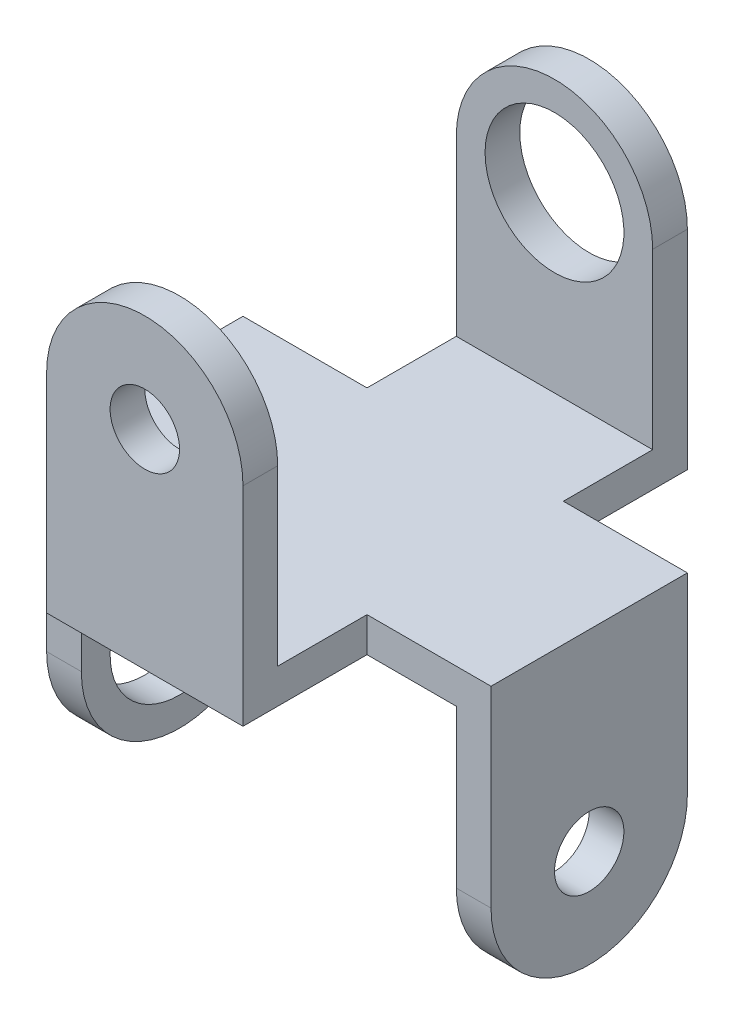
ISO-10303-21;
HEADER;
FILE_DESCRIPTION(('STEP AP214'),'2;1');
FILE_NAME('part.step','',(''),(''),'','','');
FILE_SCHEMA(('AUTOMOTIVE_DESIGN { 1 0 10303 214 1 1 1 1 }'));
ENDSEC;
DATA;
#1=APPLICATION_CONTEXT('core data for automotive mechanical design processes');
#2=APPLICATION_PROTOCOL_DEFINITION('international standard','automotive_design',2000,#1);
#3=PRODUCT_CONTEXT('',#1,'mechanical');
#4=PRODUCT('Part','Part','',(#3));
#5=PRODUCT_RELATED_PRODUCT_CATEGORY('part','',(#4));
#6=PRODUCT_DEFINITION_FORMATION('','',#4);
#7=PRODUCT_DEFINITION_CONTEXT('part definition',#1,'design');
#8=PRODUCT_DEFINITION('design','',#6,#7);
#9=PRODUCT_DEFINITION_SHAPE('','',#8);
#10=(LENGTH_UNIT() NAMED_UNIT(*) SI_UNIT(.MILLI.,.METRE.));
#11=(NAMED_UNIT(*) PLANE_ANGLE_UNIT() SI_UNIT($,.RADIAN.));
#12=(NAMED_UNIT(*) SI_UNIT($,.STERADIAN.) SOLID_ANGLE_UNIT());
#13=UNCERTAINTY_MEASURE_WITH_UNIT(LENGTH_MEASURE(1.E-05),#10,'distance_accuracy_value','');
#14=(GEOMETRIC_REPRESENTATION_CONTEXT(3) GLOBAL_UNCERTAINTY_ASSIGNED_CONTEXT((#13)) GLOBAL_UNIT_ASSIGNED_CONTEXT((#10,
#11,#12)) REPRESENTATION_CONTEXT('',''));
#15=CARTESIAN_POINT('',(0.,0.,0.));
#16=DIRECTION('',(0.,0.,1.));
#17=DIRECTION('',(1.,0.,0.));
#18=AXIS2_PLACEMENT_3D('',#15,#16,#17);
#19=CARTESIAN_POINT('',(0.,-0.867297677561354,0.));
#20=DIRECTION('',(0.,-1.,0.));
#21=DIRECTION('',(1.,0.,0.));
#22=AXIS2_PLACEMENT_3D('',#19,#20,#21);
#23=PLANE('',#22);
#24=DIRECTION('',(1.,0.,0.));
#25=VECTOR('',#24,1.);
#26=CARTESIAN_POINT('',(0.,-0.867297677561354,17.86285));
#27=LINE('',#26,#25);
#28=CARTESIAN_POINT('',(42.1458232874486,-0.867297677561364,17.86285));
#29=VERTEX_POINT('',#28);
#30=CARTESIAN_POINT('',(55.0086876637176,-0.867297677561354,17.86285));
#31=VERTEX_POINT('',#30);
#32=EDGE_CURVE('E187',#29,#31,#27,.T.);
#33=ORIENTED_EDGE('',*,*,#32,.T.);
#34=DIRECTION('',(0.,0.,1.));
#35=VECTOR('',#34,1.);
#36=CARTESIAN_POINT('',(55.0086876637176,-0.867297677561354,17.86285));
#37=LINE('',#36,#35);
#38=CARTESIAN_POINT('',(55.0086876637176,-0.867297677561354,46.14715));
#39=VERTEX_POINT('',#38);
#40=EDGE_CURVE('E175',#31,#39,#37,.T.);
#41=ORIENTED_EDGE('',*,*,#40,.T.);
#42=DIRECTION('',(1.,0.,0.));
#43=VECTOR('',#42,1.);
#44=CARTESIAN_POINT('',(0.,-0.867297677561354,46.14715));
#45=LINE('',#44,#43);
#46=CARTESIAN_POINT('',(42.1458232874486,-0.867297677561364,46.14715));
#47=VERTEX_POINT('',#46);
#48=EDGE_CURVE('E61',#47,#39,#45,.T.);
#49=ORIENTED_EDGE('',*,*,#48,.F.);
#50=DIRECTION('',(0.,0.,1.));
#51=VECTOR('',#50,1.);
#52=CARTESIAN_POINT('',(42.1458232874486,-0.867297677561364,5.));
#53=LINE('',#52,#51);
#54=CARTESIAN_POINT('',(42.1458232874486,-0.867297677561357,64.01));
#55=VERTEX_POINT('',#54);
#56=EDGE_CURVE('E263',#47,#55,#53,.T.);
#57=ORIENTED_EDGE('',*,*,#56,.T.);
#58=DIRECTION('',(1.,0.,0.));
#59=VECTOR('',#58,1.);
#60=CARTESIAN_POINT('',(13.8615520399867,-0.867297677561357,64.01));
#61=LINE('',#60,#59);
#62=CARTESIAN_POINT('',(13.8615520399867,-0.867297677561357,64.01));
#63=VERTEX_POINT('',#62);
#64=EDGE_CURVE('E223',#63,#55,#61,.T.);
#65=ORIENTED_EDGE('',*,*,#64,.F.);
#66=DIRECTION('',(0.,0.,-1.));
#67=VECTOR('',#66,1.);
#68=CARTESIAN_POINT('',(13.8615520399867,-0.867297677561357,5.));
#69=LINE('',#68,#67);
#70=CARTESIAN_POINT('',(13.8615520399867,-0.867297677561357,46.14715));
#71=VERTEX_POINT('',#70);
#72=EDGE_CURVE('E258',#63,#71,#69,.T.);
#73=ORIENTED_EDGE('',*,*,#72,.T.);
#74=CARTESIAN_POINT('',(0.998687663717631,-0.867297677561354,46.14715));
#75=VERTEX_POINT('',#74);
#76=EDGE_CURVE('E207',#75,#71,#45,.T.);
#77=ORIENTED_EDGE('',*,*,#76,.F.);
#78=DIRECTION('',(0.,0.,1.));
#79=VECTOR('',#78,1.);
#80=CARTESIAN_POINT('',(0.998687663717631,-0.867297677561354,46.14715));
#81=LINE('',#80,#79);
#82=CARTESIAN_POINT('',(0.998687663717633,-0.867297677561354,17.86285));
#83=VERTEX_POINT('',#82);
#84=EDGE_CURVE('E54',#83,#75,#81,.T.);
#85=ORIENTED_EDGE('',*,*,#84,.F.);
#86=CARTESIAN_POINT('',(13.8615520399867,-0.867297677561357,17.86285));
#87=VERTEX_POINT('',#86);
#88=EDGE_CURVE('E197',#83,#87,#27,.T.);
#89=ORIENTED_EDGE('',*,*,#88,.T.);
#90=CARTESIAN_POINT('',(13.8615520399867,-0.867297677561357,0.));
#91=VERTEX_POINT('',#90);
#92=EDGE_CURVE('E257',#87,#91,#69,.T.);
#93=ORIENTED_EDGE('',*,*,#92,.T.);
#94=DIRECTION('',(1.,0.,0.));
#95=VECTOR('',#94,1.);
#96=CARTESIAN_POINT('',(13.8615520399867,-0.867297677561357,0.));
#97=LINE('',#96,#95);
#98=CARTESIAN_POINT('',(42.1458232874486,-0.867297677561364,0.));
#99=VERTEX_POINT('',#98);
#100=EDGE_CURVE('E261',#91,#99,#97,.T.);
#101=ORIENTED_EDGE('',*,*,#100,.T.);
#102=EDGE_CURVE('E196',#99,#29,#53,.T.);
#103=ORIENTED_EDGE('',*,*,#102,.T.);
#104=EDGE_LOOP('',(#33,#41,#49,#57,#65,#73,#77,#85,#89,#93,#101,#103));
#105=FACE_BOUND('',#104,.T.);
#106=ADVANCED_FACE('F38',(#105),#23,.T.);
#107=CARTESIAN_POINT('',(13.8615520399867,4.13270232243864,5.));
#108=DIRECTION('',(1.,0.,0.));
#109=DIRECTION('',(0.,0.,-1.));
#110=AXIS2_PLACEMENT_3D('',#107,#108,#109);
#111=PLANE('',#110);
#112=DIRECTION('',(0.,1.,0.));
#113=VECTOR('',#112,1.);
#114=CARTESIAN_POINT('',(13.8615520399867,4.13270232243864,46.14715));
#115=LINE('',#114,#113);
#116=CARTESIAN_POINT('',(13.8615520399867,4.13270232243864,46.14715));
#117=VERTEX_POINT('',#116);
#118=EDGE_CURVE('E212',#71,#117,#115,.T.);
#119=ORIENTED_EDGE('',*,*,#118,.F.);
#120=ORIENTED_EDGE('',*,*,#72,.F.);
#121=DIRECTION('',(0.,-1.,0.));
#122=VECTOR('',#121,1.);
#123=CARTESIAN_POINT('',(13.8615520399867,4.13270232243864,64.01));
#124=LINE('',#123,#122);
#125=CARTESIAN_POINT('',(13.8615520399867,29.1327023224386,64.01));
#126=VERTEX_POINT('',#125);
#127=EDGE_CURVE('E220',#126,#63,#124,.T.);
#128=ORIENTED_EDGE('',*,*,#127,.F.);
#129=DIRECTION('',(0.,0.,-1.));
#130=VECTOR('',#129,1.);
#131=CARTESIAN_POINT('',(13.8615520399867,29.1327023224386,64.01));
#132=LINE('',#131,#130);
#133=CARTESIAN_POINT('',(13.8615520399867,29.1327023224386,59.01));
#134=VERTEX_POINT('',#133);
#135=EDGE_CURVE('E232',#126,#134,#132,.T.);
#136=ORIENTED_EDGE('',*,*,#135,.T.);
#137=DIRECTION('',(0.,-1.,0.));
#138=VECTOR('',#137,1.);
#139=CARTESIAN_POINT('',(13.8615520399867,29.1327023224386,59.01));
#140=LINE('',#139,#138);
#141=CARTESIAN_POINT('',(13.8615520399867,4.13270232243865,59.01));
#142=VERTEX_POINT('',#141);
#143=EDGE_CURVE('E224',#134,#142,#140,.T.);
#144=ORIENTED_EDGE('',*,*,#143,.T.);
#145=DIRECTION('',(0.,0.,-1.));
#146=VECTOR('',#145,1.);
#147=CARTESIAN_POINT('',(13.8615520399867,4.13270232243864,59.01));
#148=LINE('',#147,#146);
#149=EDGE_CURVE('E250',#142,#117,#148,.T.);
#150=ORIENTED_EDGE('',*,*,#149,.T.);
#151=EDGE_LOOP('',(#119,#120,#128,#136,#144,#150));
#152=FACE_BOUND('',#151,.T.);
#153=ADVANCED_FACE('F406',(#152),#111,.F.);
#154=CARTESIAN_POINT('',(42.1458232874486,29.1327023224386,5.));
#155=DIRECTION('',(-1.,0.,0.));
#156=DIRECTION('',(0.,-1.,0.));
#157=AXIS2_PLACEMENT_3D('',#154,#155,#156);
#158=PLANE('',#157);
#159=DIRECTION('',(0.,-1.,0.));
#160=VECTOR('',#159,1.);
#161=CARTESIAN_POINT('',(42.1458232874486,29.1327023224386,46.14715));
#162=LINE('',#161,#160);
#163=CARTESIAN_POINT('',(42.1458232874486,4.13270232243864,46.14715));
#164=VERTEX_POINT('',#163);
#165=EDGE_CURVE('E210',#164,#47,#162,.T.);
#166=ORIENTED_EDGE('',*,*,#165,.F.);
#167=DIRECTION('',(0.,0.,-1.));
#168=VECTOR('',#167,1.);
#169=CARTESIAN_POINT('',(42.1458232874486,4.13270232243864,59.01));
#170=LINE('',#169,#168);
#171=CARTESIAN_POINT('',(42.1458232874486,4.13270232243864,59.01));
#172=VERTEX_POINT('',#171);
#173=EDGE_CURVE('E254',#172,#164,#170,.T.);
#174=ORIENTED_EDGE('',*,*,#173,.F.);
#175=DIRECTION('',(0.,1.,0.));
#176=VECTOR('',#175,1.);
#177=CARTESIAN_POINT('',(42.1458232874486,4.13270232243864,59.01));
#178=LINE('',#177,#176);
#179=CARTESIAN_POINT('',(42.1458232874486,29.1327023224386,59.01));
#180=VERTEX_POINT('',#179);
#181=EDGE_CURVE('E219',#172,#180,#178,.T.);
#182=ORIENTED_EDGE('',*,*,#181,.T.);
#183=DIRECTION('',(0.,0.,-1.));
#184=VECTOR('',#183,1.);
#185=CARTESIAN_POINT('',(42.1458232874486,29.1327023224386,64.01));
#186=LINE('',#185,#184);
#187=CARTESIAN_POINT('',(42.1458232874486,29.1327023224386,64.01));
#188=VERTEX_POINT('',#187);
#189=EDGE_CURVE('E240',#188,#180,#186,.T.);
#190=ORIENTED_EDGE('',*,*,#189,.F.);
#191=DIRECTION('',(0.,1.,0.));
#192=VECTOR('',#191,1.);
#193=CARTESIAN_POINT('',(42.1458232874486,-0.867297677561357,64.01));
#194=LINE('',#193,#192);
#195=EDGE_CURVE('E227',#55,#188,#194,.T.);
#196=ORIENTED_EDGE('',*,*,#195,.F.);
#197=ORIENTED_EDGE('',*,*,#56,.F.);
#198=EDGE_LOOP('',(#166,#174,#182,#190,#196,#197));
#199=FACE_BOUND('',#198,.T.);
#200=ADVANCED_FACE('F411',(#199),#158,.F.);
#201=CARTESIAN_POINT('',(28.0036876637176,29.1327023224386,5.));
#202=DIRECTION('',(0.,0.,-1.));
#203=DIRECTION('',(-1.,0.,0.));
#204=AXIS2_PLACEMENT_3D('',#201,#202,#203);
#205=CYLINDRICAL_SURFACE('',#204,14.1421356237309);
#206=CARTESIAN_POINT('',(28.0036876637176,29.1327023224386,0.));
#207=DIRECTION('',(0.,0.,1.));
#208=DIRECTION('',(1.,0.,0.));
#209=AXIS2_PLACEMENT_3D('',#206,#207,#208);
#210=CIRCLE('',#209,14.1421356237309);
#211=CARTESIAN_POINT('',(42.1458232874486,29.1327023224386,0.));
#212=VERTEX_POINT('',#211);
#213=CARTESIAN_POINT('',(13.8615520399867,29.1327023224386,0.));
#214=VERTEX_POINT('',#213);
#215=EDGE_CURVE('E265',#212,#214,#210,.T.);
#216=ORIENTED_EDGE('',*,*,#215,.T.);
#217=DIRECTION('',(0.,0.,-1.));
#218=VECTOR('',#217,1.);
#219=CARTESIAN_POINT('',(13.8615520399867,29.1327023224386,5.));
#220=LINE('',#219,#218);
#221=CARTESIAN_POINT('',(13.8615520399867,29.1327023224386,5.));
#222=VERTEX_POINT('',#221);
#223=EDGE_CURVE('E11',#222,#214,#220,.T.);
#224=ORIENTED_EDGE('',*,*,#223,.F.);
#225=CARTESIAN_POINT('',(28.0036876637176,29.1327023224386,5.));
#226=DIRECTION('',(0.,0.,1.));
#227=DIRECTION('',(1.,0.,0.));
#228=AXIS2_PLACEMENT_3D('',#225,#226,#227);
#229=CIRCLE('',#228,14.1421356237309);
#230=CARTESIAN_POINT('',(42.1458232874486,29.1327023224386,5.));
#231=VERTEX_POINT('',#230);
#232=EDGE_CURVE('E266',#231,#222,#229,.T.);
#233=ORIENTED_EDGE('',*,*,#232,.F.);
#234=DIRECTION('',(0.,0.,-1.));
#235=VECTOR('',#234,1.);
#236=CARTESIAN_POINT('',(42.1458232874486,29.1327023224386,5.));
#237=LINE('',#236,#235);
#238=EDGE_CURVE('E47',#231,#212,#237,.T.);
#239=ORIENTED_EDGE('',*,*,#238,.T.);
#240=EDGE_LOOP('',(#216,#224,#233,#239));
#241=FACE_BOUND('',#240,.T.);
#242=ADVANCED_FACE('F40',(#241),#205,.T.);
#243=ORIENTED_EDGE('',*,*,#92,.F.);
#244=DIRECTION('',(0.,1.,0.));
#245=VECTOR('',#244,1.);
#246=CARTESIAN_POINT('',(13.8615520399867,4.13270232243864,17.86285));
#247=LINE('',#246,#245);
#248=CARTESIAN_POINT('',(13.8615520399867,4.13270232243864,17.86285));
#249=VERTEX_POINT('',#248);
#250=EDGE_CURVE('E216',#87,#249,#247,.T.);
#251=ORIENTED_EDGE('',*,*,#250,.T.);
#252=CARTESIAN_POINT('',(13.8615520399867,4.13270232243864,5.));
#253=VERTEX_POINT('',#252);
#254=EDGE_CURVE('E247',#249,#253,#148,.T.);
#255=ORIENTED_EDGE('',*,*,#254,.T.);
#256=DIRECTION('',(0.,-1.,0.));
#257=VECTOR('',#256,1.);
#258=CARTESIAN_POINT('',(13.8615520399867,4.13270232243864,5.));
#259=LINE('',#258,#257);
#260=EDGE_CURVE('E269',#222,#253,#259,.T.);
#261=ORIENTED_EDGE('',*,*,#260,.F.);
#262=ORIENTED_EDGE('',*,*,#223,.T.);
#263=DIRECTION('',(0.,-1.,0.));
#264=VECTOR('',#263,1.);
#265=CARTESIAN_POINT('',(13.8615520399867,4.13270232243864,0.));
#266=LINE('',#265,#264);
#267=EDGE_CURVE('E277',#214,#91,#266,.T.);
#268=ORIENTED_EDGE('',*,*,#267,.T.);
#269=EDGE_LOOP('',(#243,#251,#255,#261,#262,#268));
#270=FACE_BOUND('',#269,.T.);
#271=ADVANCED_FACE('F294',(#270),#111,.F.);
#272=CARTESIAN_POINT('',(42.1458232874486,4.13270232243864,17.86285));
#273=VERTEX_POINT('',#272);
#274=CARTESIAN_POINT('',(42.1458232874486,4.13270232243864,5.));
#275=VERTEX_POINT('',#274);
#276=EDGE_CURVE('E253',#273,#275,#170,.T.);
#277=ORIENTED_EDGE('',*,*,#276,.F.);
#278=DIRECTION('',(0.,-1.,0.));
#279=VECTOR('',#278,1.);
#280=CARTESIAN_POINT('',(42.1458232874486,29.1327023224386,17.86285));
#281=LINE('',#280,#279);
#282=EDGE_CURVE('E214',#273,#29,#281,.T.);
#283=ORIENTED_EDGE('',*,*,#282,.T.);
#284=ORIENTED_EDGE('',*,*,#102,.F.);
#285=DIRECTION('',(0.,1.,0.));
#286=VECTOR('',#285,1.);
#287=CARTESIAN_POINT('',(42.1458232874486,29.1327023224386,0.));
#288=LINE('',#287,#286);
#289=EDGE_CURVE('E270',#99,#212,#288,.T.);
#290=ORIENTED_EDGE('',*,*,#289,.T.);
#291=ORIENTED_EDGE('',*,*,#238,.F.);
#292=DIRECTION('',(0.,1.,0.));
#293=VECTOR('',#292,1.);
#294=CARTESIAN_POINT('',(42.1458232874486,29.1327023224386,5.));
#295=LINE('',#294,#293);
#296=EDGE_CURVE('E273',#275,#231,#295,.T.);
#297=ORIENTED_EDGE('',*,*,#296,.F.);
#298=EDGE_LOOP('',(#277,#283,#284,#290,#291,#297));
#299=FACE_BOUND('',#298,.T.);
#300=ADVANCED_FACE('F300',(#299),#158,.F.);
#301=CARTESIAN_POINT('',(28.0036876637176,29.1327023224386,5.));
#302=DIRECTION('',(0.,0.,1.));
#303=DIRECTION('',(1.,0.,0.));
#304=AXIS2_PLACEMENT_3D('',#301,#302,#303);
#305=PLANE('',#304);
#306=CARTESIAN_POINT('',(28.0036876637176,29.1327023224386,5.));
#307=DIRECTION('',(0.,0.,-1.));
#308=DIRECTION('',(-1.,0.,0.));
#309=AXIS2_PLACEMENT_3D('',#306,#307,#308);
#310=CIRCLE('',#309,10.);
#311=CARTESIAN_POINT('',(18.0036876637176,29.1327023224386,5.));
#312=VERTEX_POINT('',#311);
#313=EDGE_CURVE('E358',#312,#312,#310,.T.);
#314=ORIENTED_EDGE('',*,*,#313,.T.);
#315=EDGE_LOOP('',(#314));
#316=FACE_BOUND('',#315,.T.);
#317=DIRECTION('',(-1.,0.,0.));
#318=VECTOR('',#317,1.);
#319=CARTESIAN_POINT('',(13.8615520399867,4.13270232243864,5.));
#320=LINE('',#319,#318);
#321=EDGE_CURVE('E243',#275,#253,#320,.T.);
#322=ORIENTED_EDGE('',*,*,#321,.F.);
#323=ORIENTED_EDGE('',*,*,#296,.T.);
#324=ORIENTED_EDGE('',*,*,#232,.T.);
#325=ORIENTED_EDGE('',*,*,#260,.T.);
#326=EDGE_LOOP('',(#322,#323,#324,#325));
#327=FACE_BOUND('',#326,.T.);
#328=ADVANCED_FACE('F298',(#316,#327),#305,.T.);
#329=CARTESIAN_POINT('',(28.0036876637176,29.1327023224386,0.));
#330=DIRECTION('',(0.,0.,1.));
#331=DIRECTION('',(1.,0.,0.));
#332=AXIS2_PLACEMENT_3D('',#329,#330,#331);
#333=PLANE('',#332);
#334=CARTESIAN_POINT('',(28.0036876637176,29.1327023224386,0.));
#335=DIRECTION('',(0.,0.,-1.));
#336=DIRECTION('',(-1.,0.,0.));
#337=AXIS2_PLACEMENT_3D('',#334,#335,#336);
#338=CIRCLE('',#337,10.);
#339=CARTESIAN_POINT('',(18.0036876637176,29.1327023224386,0.));
#340=VERTEX_POINT('',#339);
#341=EDGE_CURVE('E359',#340,#340,#338,.T.);
#342=ORIENTED_EDGE('',*,*,#341,.F.);
#343=EDGE_LOOP('',(#342));
#344=FACE_BOUND('',#343,.T.);
#345=ORIENTED_EDGE('',*,*,#215,.F.);
#346=ORIENTED_EDGE('',*,*,#289,.F.);
#347=ORIENTED_EDGE('',*,*,#100,.F.);
#348=ORIENTED_EDGE('',*,*,#267,.F.);
#349=EDGE_LOOP('',(#345,#346,#347,#348));
#350=FACE_BOUND('',#349,.T.);
#351=ADVANCED_FACE('F290',(#344,#350),#333,.F.);
#352=CARTESIAN_POINT('',(13.8615520399867,4.13270232243864,59.01));
#353=DIRECTION('',(0.,-1.,0.));
#354=DIRECTION('',(0.,0.,-1.));
#355=AXIS2_PLACEMENT_3D('',#352,#353,#354);
#356=PLANE('',#355);
#357=ORIENTED_EDGE('',*,*,#254,.F.);
#358=DIRECTION('',(1.,0.,0.));
#359=VECTOR('',#358,1.);
#360=CARTESIAN_POINT('',(0.,4.13270232243865,17.86285));
#361=LINE('',#360,#359);
#362=CARTESIAN_POINT('',(-4.00131233628237,4.13270232243865,17.86285));
#363=VERTEX_POINT('',#362);
#364=EDGE_CURVE('E308',#363,#249,#361,.T.);
#365=ORIENTED_EDGE('',*,*,#364,.F.);
#366=DIRECTION('',(0.,0.,-1.));
#367=VECTOR('',#366,1.);
#368=CARTESIAN_POINT('',(-4.00131233628237,4.13270232243865,17.86285));
#369=LINE('',#368,#367);
#370=CARTESIAN_POINT('',(-4.00131233628237,4.13270232243865,46.14715));
#371=VERTEX_POINT('',#370);
#372=EDGE_CURVE('E198',#371,#363,#369,.T.);
#373=ORIENTED_EDGE('',*,*,#372,.F.);
#374=DIRECTION('',(1.,0.,0.));
#375=VECTOR('',#374,1.);
#376=CARTESIAN_POINT('',(0.,4.13270232243865,46.14715));
#377=LINE('',#376,#375);
#378=EDGE_CURVE('E205',#371,#117,#377,.T.);
#379=ORIENTED_EDGE('',*,*,#378,.T.);
#380=ORIENTED_EDGE('',*,*,#149,.F.);
#381=DIRECTION('',(-1.,0.,0.));
#382=VECTOR('',#381,1.);
#383=CARTESIAN_POINT('',(13.8615520399867,4.13270232243864,59.01));
#384=LINE('',#383,#382);
#385=EDGE_CURVE('E244',#172,#142,#384,.T.);
#386=ORIENTED_EDGE('',*,*,#385,.F.);
#387=ORIENTED_EDGE('',*,*,#173,.T.);
#388=CARTESIAN_POINT('',(60.0086876637176,4.13270232243863,46.14715));
#389=VERTEX_POINT('',#388);
#390=EDGE_CURVE('E309',#164,#389,#377,.T.);
#391=ORIENTED_EDGE('',*,*,#390,.T.);
#392=DIRECTION('',(0.,0.,1.));
#393=VECTOR('',#392,1.);
#394=CARTESIAN_POINT('',(60.0086876637176,4.13270232243863,17.86285));
#395=LINE('',#394,#393);
#396=CARTESIAN_POINT('',(60.0086876637176,4.13270232243863,17.86285));
#397=VERTEX_POINT('',#396);
#398=EDGE_CURVE('E306',#397,#389,#395,.T.);
#399=ORIENTED_EDGE('',*,*,#398,.F.);
#400=EDGE_CURVE('E209',#273,#397,#361,.T.);
#401=ORIENTED_EDGE('',*,*,#400,.F.);
#402=ORIENTED_EDGE('',*,*,#276,.T.);
#403=ORIENTED_EDGE('',*,*,#321,.T.);
#404=EDGE_LOOP('',(#357,#365,#373,#379,#380,#386,#387,#391,#399,#401,#402,#403));
#405=FACE_BOUND('',#404,.T.);
#406=ADVANCED_FACE('F303',(#405),#356,.F.);
#407=CARTESIAN_POINT('',(28.0036876637176,29.1327023224386,59.01));
#408=DIRECTION('',(0.,0.,1.));
#409=DIRECTION('',(1.,0.,0.));
#410=AXIS2_PLACEMENT_3D('',#407,#408,#409);
#411=PLANE('',#410);
#412=CARTESIAN_POINT('',(28.0036876637176,29.1327023224386,59.01));
#413=DIRECTION('',(0.,0.,1.));
#414=DIRECTION('',(1.,0.,0.));
#415=AXIS2_PLACEMENT_3D('',#412,#413,#414);
#416=CIRCLE('',#415,5.);
#417=CARTESIAN_POINT('',(33.0036876637176,29.1327023224386,59.01));
#418=VERTEX_POINT('',#417);
#419=EDGE_CURVE('E347',#418,#418,#416,.T.);
#420=ORIENTED_EDGE('',*,*,#419,.T.);
#421=EDGE_LOOP('',(#420));
#422=FACE_BOUND('',#421,.T.);
#423=ORIENTED_EDGE('',*,*,#181,.F.);
#424=ORIENTED_EDGE('',*,*,#385,.T.);
#425=ORIENTED_EDGE('',*,*,#143,.F.);
#426=CARTESIAN_POINT('',(28.0036876637176,29.1327023224386,59.01));
#427=DIRECTION('',(0.,0.,1.));
#428=DIRECTION('',(1.,0.,0.));
#429=AXIS2_PLACEMENT_3D('',#426,#427,#428);
#430=CIRCLE('',#429,14.1421356237309);
#431=EDGE_CURVE('E234',#180,#134,#430,.T.);
#432=ORIENTED_EDGE('',*,*,#431,.F.);
#433=EDGE_LOOP('',(#423,#424,#425,#432));
#434=FACE_BOUND('',#433,.T.);
#435=ADVANCED_FACE('F442',(#422,#434),#411,.F.);
#436=CARTESIAN_POINT('',(28.0036876637176,29.1327023224386,64.01));
#437=DIRECTION('',(0.,0.,-1.));
#438=DIRECTION('',(-1.,0.,0.));
#439=AXIS2_PLACEMENT_3D('',#436,#437,#438);
#440=CYLINDRICAL_SURFACE('',#439,14.1421356237309);
#441=ORIENTED_EDGE('',*,*,#431,.T.);
#442=ORIENTED_EDGE('',*,*,#135,.F.);
#443=CARTESIAN_POINT('',(28.0036876637176,29.1327023224386,64.01));
#444=DIRECTION('',(0.,0.,1.));
#445=DIRECTION('',(1.,0.,0.));
#446=AXIS2_PLACEMENT_3D('',#443,#444,#445);
#447=CIRCLE('',#446,14.1421356237309);
#448=EDGE_CURVE('E229',#188,#126,#447,.T.);
#449=ORIENTED_EDGE('',*,*,#448,.F.);
#450=ORIENTED_EDGE('',*,*,#189,.T.);
#451=EDGE_LOOP('',(#441,#442,#449,#450));
#452=FACE_BOUND('',#451,.T.);
#453=ADVANCED_FACE('F446',(#452),#440,.T.);
#454=CARTESIAN_POINT('',(28.0036876637176,29.1327023224386,64.01));
#455=DIRECTION('',(0.,0.,1.));
#456=DIRECTION('',(1.,0.,0.));
#457=AXIS2_PLACEMENT_3D('',#454,#455,#456);
#458=PLANE('',#457);
#459=CARTESIAN_POINT('',(28.0036876637176,29.1327023224386,64.01));
#460=DIRECTION('',(0.,0.,1.));
#461=DIRECTION('',(1.,0.,0.));
#462=AXIS2_PLACEMENT_3D('',#459,#460,#461);
#463=CIRCLE('',#462,5.);
#464=CARTESIAN_POINT('',(33.0036876637176,29.1327023224386,64.01));
#465=VERTEX_POINT('',#464);
#466=EDGE_CURVE('E350',#465,#465,#463,.T.);
#467=ORIENTED_EDGE('',*,*,#466,.F.);
#468=EDGE_LOOP('',(#467));
#469=FACE_BOUND('',#468,.T.);
#470=ORIENTED_EDGE('',*,*,#127,.T.);
#471=ORIENTED_EDGE('',*,*,#64,.T.);
#472=ORIENTED_EDGE('',*,*,#195,.T.);
#473=ORIENTED_EDGE('',*,*,#448,.T.);
#474=EDGE_LOOP('',(#470,#471,#472,#473));
#475=FACE_BOUND('',#474,.T.);
#476=ADVANCED_FACE('F449',(#469,#475),#458,.T.);
#477=CARTESIAN_POINT('',(0.,4.13270232243865,46.14715));
#478=DIRECTION('',(0.,0.,-1.));
#479=DIRECTION('',(-1.,0.,0.));
#480=AXIS2_PLACEMENT_3D('',#477,#478,#479);
#481=PLANE('',#480);
#482=ORIENTED_EDGE('',*,*,#390,.F.);
#483=ORIENTED_EDGE('',*,*,#165,.T.);
#484=ORIENTED_EDGE('',*,*,#48,.T.);
#485=DIRECTION('',(0.,-1.,0.));
#486=VECTOR('',#485,1.);
#487=CARTESIAN_POINT('',(55.0086876637176,-0.867297677561354,46.14715));
#488=LINE('',#487,#486);
#489=CARTESIAN_POINT('',(55.0086876637176,-23.5480976775614,46.14715));
#490=VERTEX_POINT('',#489);
#491=EDGE_CURVE('E182',#39,#490,#488,.T.);
#492=ORIENTED_EDGE('',*,*,#491,.T.);
#493=DIRECTION('',(1.,0.,0.));
#494=VECTOR('',#493,1.);
#495=CARTESIAN_POINT('',(55.0086876637176,-23.5480976775614,46.14715));
#496=LINE('',#495,#494);
#497=CARTESIAN_POINT('',(60.0086876637176,-23.5480976775614,46.14715));
#498=VERTEX_POINT('',#497);
#499=EDGE_CURVE('E340',#490,#498,#496,.T.);
#500=ORIENTED_EDGE('',*,*,#499,.T.);
#501=DIRECTION('',(0.,-1.,0.));
#502=VECTOR('',#501,1.);
#503=CARTESIAN_POINT('',(60.0086876637176,4.13270232243863,46.14715));
#504=LINE('',#503,#502);
#505=EDGE_CURVE('E338',#389,#498,#504,.T.);
#506=ORIENTED_EDGE('',*,*,#505,.F.);
#507=EDGE_LOOP('',(#482,#483,#484,#492,#500,#506));
#508=FACE_BOUND('',#507,.T.);
#509=ADVANCED_FACE('F453',(#508),#481,.F.);
#510=CARTESIAN_POINT('',(0.,4.13270232243865,17.86285));
#511=DIRECTION('',(0.,0.,-1.));
#512=DIRECTION('',(-1.,0.,0.));
#513=AXIS2_PLACEMENT_3D('',#510,#511,#512);
#514=PLANE('',#513);
#515=ORIENTED_EDGE('',*,*,#282,.F.);
#516=ORIENTED_EDGE('',*,*,#400,.T.);
#517=DIRECTION('',(0.,1.,0.));
#518=VECTOR('',#517,1.);
#519=CARTESIAN_POINT('',(60.0086876637176,-0.867297677561368,17.86285));
#520=LINE('',#519,#518);
#521=CARTESIAN_POINT('',(60.0086876637176,-23.5480976775614,17.86285));
#522=VERTEX_POINT('',#521);
#523=EDGE_CURVE('E336',#522,#397,#520,.T.);
#524=ORIENTED_EDGE('',*,*,#523,.F.);
#525=DIRECTION('',(1.,0.,0.));
#526=VECTOR('',#525,1.);
#527=CARTESIAN_POINT('',(55.0086876637176,-23.5480976775614,17.86285));
#528=LINE('',#527,#526);
#529=CARTESIAN_POINT('',(55.0086876637176,-23.5480976775614,17.86285));
#530=VERTEX_POINT('',#529);
#531=EDGE_CURVE('E190',#530,#522,#528,.T.);
#532=ORIENTED_EDGE('',*,*,#531,.F.);
#533=DIRECTION('',(0.,1.,0.));
#534=VECTOR('',#533,1.);
#535=CARTESIAN_POINT('',(55.0086876637176,-23.5480976775614,17.86285));
#536=LINE('',#535,#534);
#537=EDGE_CURVE('E179',#530,#31,#536,.T.);
#538=ORIENTED_EDGE('',*,*,#537,.T.);
#539=ORIENTED_EDGE('',*,*,#32,.F.);
#540=EDGE_LOOP('',(#515,#516,#524,#532,#538,#539));
#541=FACE_BOUND('',#540,.T.);
#542=ADVANCED_FACE('F186',(#541),#514,.T.);
#543=ORIENTED_EDGE('',*,*,#250,.F.);
#544=ORIENTED_EDGE('',*,*,#88,.F.);
#545=DIRECTION('',(0.,1.,0.));
#546=VECTOR('',#545,1.);
#547=CARTESIAN_POINT('',(0.998687663717629,-23.5480976775614,17.86285));
#548=LINE('',#547,#546);
#549=CARTESIAN_POINT('',(0.998687663717629,-23.5480976775614,17.86285));
#550=VERTEX_POINT('',#549);
#551=EDGE_CURVE('E316',#550,#83,#548,.T.);
#552=ORIENTED_EDGE('',*,*,#551,.F.);
#553=DIRECTION('',(1.,0.,0.));
#554=VECTOR('',#553,1.);
#555=CARTESIAN_POINT('',(-4.00131233628237,-23.5480976775614,17.86285));
#556=LINE('',#555,#554);
#557=CARTESIAN_POINT('',(-4.00131233628237,-23.5480976775614,17.86285));
#558=VERTEX_POINT('',#557);
#559=EDGE_CURVE('E324',#558,#550,#556,.T.);
#560=ORIENTED_EDGE('',*,*,#559,.F.);
#561=DIRECTION('',(0.,-1.,0.));
#562=VECTOR('',#561,1.);
#563=CARTESIAN_POINT('',(-4.00131233628237,4.13270232243865,17.86285));
#564=LINE('',#563,#562);
#565=EDGE_CURVE('E313',#363,#558,#564,.T.);
#566=ORIENTED_EDGE('',*,*,#565,.F.);
#567=ORIENTED_EDGE('',*,*,#364,.T.);
#568=EDGE_LOOP('',(#543,#544,#552,#560,#566,#567));
#569=FACE_BOUND('',#568,.T.);
#570=ADVANCED_FACE('F397',(#569),#514,.T.);
#571=DIRECTION('',(0.,1.,0.));
#572=VECTOR('',#571,1.);
#573=CARTESIAN_POINT('',(-4.00131233628237,4.13270232243865,46.14715));
#574=LINE('',#573,#572);
#575=CARTESIAN_POINT('',(-4.00131233628237,-23.5480976775614,46.14715));
#576=VERTEX_POINT('',#575);
#577=EDGE_CURVE('E201',#576,#371,#574,.T.);
#578=ORIENTED_EDGE('',*,*,#577,.F.);
#579=DIRECTION('',(-1.,0.,0.));
#580=VECTOR('',#579,1.);
#581=CARTESIAN_POINT('',(-4.00131233628237,-23.5480976775614,46.14715));
#582=LINE('',#581,#580);
#583=CARTESIAN_POINT('',(0.998687663717625,-23.5480976775614,46.14715));
#584=VERTEX_POINT('',#583);
#585=EDGE_CURVE('E322',#584,#576,#582,.T.);
#586=ORIENTED_EDGE('',*,*,#585,.F.);
#587=DIRECTION('',(0.,1.,0.));
#588=VECTOR('',#587,1.);
#589=CARTESIAN_POINT('',(0.998687663717625,-23.5480976775614,46.14715));
#590=LINE('',#589,#588);
#591=EDGE_CURVE('E319',#584,#75,#590,.T.);
#592=ORIENTED_EDGE('',*,*,#591,.T.);
#593=ORIENTED_EDGE('',*,*,#76,.T.);
#594=ORIENTED_EDGE('',*,*,#118,.T.);
#595=ORIENTED_EDGE('',*,*,#378,.F.);
#596=EDGE_LOOP('',(#578,#586,#592,#593,#594,#595));
#597=FACE_BOUND('',#596,.T.);
#598=ADVANCED_FACE('F384',(#597),#481,.F.);
#599=CARTESIAN_POINT('',(-4.00131233628237,0.,0.));
#600=DIRECTION('',(-1.,0.,0.));
#601=DIRECTION('',(0.,-1.,0.));
#602=AXIS2_PLACEMENT_3D('',#599,#600,#601);
#603=PLANE('',#602);
#604=CARTESIAN_POINT('',(-4.00131233628237,-23.5480976775614,32.005));
#605=DIRECTION('',(-1.,0.,0.));
#606=DIRECTION('',(0.,-1.,0.));
#607=AXIS2_PLACEMENT_3D('',#604,#605,#606);
#608=CIRCLE('',#607,10.);
#609=CARTESIAN_POINT('',(-4.00131233628238,-33.5480976775614,32.005));
#610=VERTEX_POINT('',#609);
#611=EDGE_CURVE('E365',#610,#610,#608,.T.);
#612=ORIENTED_EDGE('',*,*,#611,.F.);
#613=EDGE_LOOP('',(#612));
#614=FACE_BOUND('',#613,.T.);
#615=ORIENTED_EDGE('',*,*,#565,.T.);
#616=CARTESIAN_POINT('',(-4.00131233628237,-23.5480976775614,32.005));
#617=DIRECTION('',(-1.,0.,0.));
#618=DIRECTION('',(0.,-1.,0.));
#619=AXIS2_PLACEMENT_3D('',#616,#617,#618);
#620=CIRCLE('',#619,14.14215);
#621=EDGE_CURVE('E330',#558,#576,#620,.T.);
#622=ORIENTED_EDGE('',*,*,#621,.T.);
#623=ORIENTED_EDGE('',*,*,#577,.T.);
#624=ORIENTED_EDGE('',*,*,#372,.T.);
#625=EDGE_LOOP('',(#615,#622,#623,#624));
#626=FACE_BOUND('',#625,.T.);
#627=ADVANCED_FACE('F381',(#614,#626),#603,.T.);
#628=CARTESIAN_POINT('',(0.998687663717625,-23.5480976775614,46.14715));
#629=DIRECTION('',(-1.,0.,0.));
#630=DIRECTION('',(0.,-1.,0.));
#631=AXIS2_PLACEMENT_3D('',#628,#629,#630);
#632=PLANE('',#631);
#633=CARTESIAN_POINT('',(0.998687663717625,-23.5480976775614,32.005));
#634=DIRECTION('',(-1.,0.,0.));
#635=DIRECTION('',(0.,-1.,0.));
#636=AXIS2_PLACEMENT_3D('',#633,#634,#635);
#637=CIRCLE('',#636,10.);
#638=CARTESIAN_POINT('',(0.998687663717622,-33.5480976775614,32.005));
#639=VERTEX_POINT('',#638);
#640=EDGE_CURVE('E362',#639,#639,#637,.T.);
#641=ORIENTED_EDGE('',*,*,#640,.T.);
#642=EDGE_LOOP('',(#641));
#643=FACE_BOUND('',#642,.T.);
#644=ORIENTED_EDGE('',*,*,#84,.T.);
#645=ORIENTED_EDGE('',*,*,#591,.F.);
#646=CARTESIAN_POINT('',(0.998687663717625,-23.5480976775614,32.005));
#647=DIRECTION('',(-1.,0.,0.));
#648=DIRECTION('',(0.,-1.,0.));
#649=AXIS2_PLACEMENT_3D('',#646,#647,#648);
#650=CIRCLE('',#649,14.14215);
#651=EDGE_CURVE('E325',#550,#584,#650,.T.);
#652=ORIENTED_EDGE('',*,*,#651,.F.);
#653=ORIENTED_EDGE('',*,*,#551,.T.);
#654=EDGE_LOOP('',(#644,#645,#652,#653));
#655=FACE_BOUND('',#654,.T.);
#656=ADVANCED_FACE('F371',(#643,#655),#632,.F.);
#657=CARTESIAN_POINT('',(0.998687663717625,-23.5480976775614,32.005));
#658=DIRECTION('',(-1.,0.,0.));
#659=DIRECTION('',(0.,-1.,0.));
#660=AXIS2_PLACEMENT_3D('',#657,#658,#659);
#661=CYLINDRICAL_SURFACE('',#660,14.14215);
#662=ORIENTED_EDGE('',*,*,#621,.F.);
#663=ORIENTED_EDGE('',*,*,#559,.T.);
#664=ORIENTED_EDGE('',*,*,#651,.T.);
#665=ORIENTED_EDGE('',*,*,#585,.T.);
#666=EDGE_LOOP('',(#662,#663,#664,#665));
#667=FACE_BOUND('',#666,.T.);
#668=ADVANCED_FACE('F391',(#667),#661,.T.);
#669=CARTESIAN_POINT('',(60.0086876637176,0.,0.));
#670=DIRECTION('',(1.,0.,0.));
#671=DIRECTION('',(0.,0.,-1.));
#672=AXIS2_PLACEMENT_3D('',#669,#670,#671);
#673=PLANE('',#672);
#674=CARTESIAN_POINT('',(60.0086876637176,-23.5480976775614,32.005));
#675=DIRECTION('',(1.,0.,0.));
#676=DIRECTION('',(0.,0.,-1.));
#677=AXIS2_PLACEMENT_3D('',#674,#675,#676);
#678=CIRCLE('',#677,5.);
#679=CARTESIAN_POINT('',(60.0086876637176,-23.5480976775614,27.005));
#680=VERTEX_POINT('',#679);
#681=EDGE_CURVE('E355',#680,#680,#678,.T.);
#682=ORIENTED_EDGE('',*,*,#681,.F.);
#683=EDGE_LOOP('',(#682));
#684=FACE_BOUND('',#683,.T.);
#685=ORIENTED_EDGE('',*,*,#505,.T.);
#686=CARTESIAN_POINT('',(60.0086876637176,-23.5480976775614,32.005));
#687=DIRECTION('',(1.,0.,0.));
#688=DIRECTION('',(0.,0.,-1.));
#689=AXIS2_PLACEMENT_3D('',#686,#687,#688);
#690=CIRCLE('',#689,14.14215);
#691=EDGE_CURVE('E191',#498,#522,#690,.T.);
#692=ORIENTED_EDGE('',*,*,#691,.T.);
#693=ORIENTED_EDGE('',*,*,#523,.T.);
#694=ORIENTED_EDGE('',*,*,#398,.T.);
#695=EDGE_LOOP('',(#685,#692,#693,#694));
#696=FACE_BOUND('',#695,.T.);
#697=ADVANCED_FACE('F403',(#684,#696),#673,.T.);
#698=CARTESIAN_POINT('',(55.0086876637176,-23.5480976775614,32.005));
#699=DIRECTION('',(1.,0.,0.));
#700=DIRECTION('',(0.,0.,-1.));
#701=AXIS2_PLACEMENT_3D('',#698,#699,#700);
#702=CYLINDRICAL_SURFACE('',#701,14.14215);
#703=ORIENTED_EDGE('',*,*,#691,.F.);
#704=ORIENTED_EDGE('',*,*,#499,.F.);
#705=CARTESIAN_POINT('',(55.0086876637176,-23.5480976775614,32.005));
#706=DIRECTION('',(1.,0.,0.));
#707=DIRECTION('',(0.,0.,-1.));
#708=AXIS2_PLACEMENT_3D('',#705,#706,#707);
#709=CIRCLE('',#708,14.14215);
#710=EDGE_CURVE('E343',#490,#530,#709,.T.);
#711=ORIENTED_EDGE('',*,*,#710,.T.);
#712=ORIENTED_EDGE('',*,*,#531,.T.);
#713=EDGE_LOOP('',(#703,#704,#711,#712));
#714=FACE_BOUND('',#713,.T.);
#715=ADVANCED_FACE('F482',(#714),#702,.T.);
#716=CARTESIAN_POINT('',(55.0086876637176,-23.5480976775614,32.005));
#717=DIRECTION('',(1.,0.,0.));
#718=DIRECTION('',(0.,0.,-1.));
#719=AXIS2_PLACEMENT_3D('',#716,#717,#718);
#720=PLANE('',#719);
#721=CARTESIAN_POINT('',(55.0086876637176,-23.5480976775614,32.005));
#722=DIRECTION('',(1.,0.,0.));
#723=DIRECTION('',(0.,0.,-1.));
#724=AXIS2_PLACEMENT_3D('',#721,#722,#723);
#725=CIRCLE('',#724,5.);
#726=CARTESIAN_POINT('',(55.0086876637176,-23.5480976775614,27.005));
#727=VERTEX_POINT('',#726);
#728=EDGE_CURVE('E42',#727,#727,#725,.T.);
#729=ORIENTED_EDGE('',*,*,#728,.T.);
#730=EDGE_LOOP('',(#729));
#731=FACE_BOUND('',#730,.T.);
#732=ORIENTED_EDGE('',*,*,#537,.F.);
#733=ORIENTED_EDGE('',*,*,#710,.F.);
#734=ORIENTED_EDGE('',*,*,#491,.F.);
#735=ORIENTED_EDGE('',*,*,#40,.F.);
#736=EDGE_LOOP('',(#732,#733,#734,#735));
#737=FACE_BOUND('',#736,.T.);
#738=ADVANCED_FACE('F177',(#731,#737),#720,.F.);
#739=CARTESIAN_POINT('',(28.0036876637176,29.1327023224386,59.01));
#740=DIRECTION('',(0.,0.,1.));
#741=DIRECTION('',(1.,0.,0.));
#742=AXIS2_PLACEMENT_3D('',#739,#740,#741);
#743=CYLINDRICAL_SURFACE('',#742,5.);
#744=ORIENTED_EDGE('',*,*,#419,.F.);
#745=EDGE_LOOP('',(#744));
#746=FACE_BOUND('',#745,.T.);
#747=ORIENTED_EDGE('',*,*,#466,.T.);
#748=EDGE_LOOP('',(#747));
#749=FACE_BOUND('',#748,.T.);
#750=ADVANCED_FACE('F471',(#746,#749),#743,.F.);
#751=CARTESIAN_POINT('',(45.9086876637176,-23.5480976775614,32.005));
#752=DIRECTION('',(1.,0.,0.));
#753=DIRECTION('',(0.,0.,-1.));
#754=AXIS2_PLACEMENT_3D('',#751,#752,#753);
#755=CYLINDRICAL_SURFACE('',#754,5.);
#756=CARTESIAN_POINT('',(60.0086876637176,-23.5480976775614,27.005));
#757=CARTESIAN_POINT('',(59.9566043303843,-23.5480976775614,27.005));
#758=CARTESIAN_POINT('',(59.904520997051,-23.5480976775614,27.005));
#759=CARTESIAN_POINT('',(59.8003543303843,-23.5480976775614,27.005));
#760=CARTESIAN_POINT('',(59.748270997051,-23.5480976775614,27.005));
#761=CARTESIAN_POINT('',(59.6441043303843,-23.5480976775614,27.005));
#762=CARTESIAN_POINT('',(59.592020997051,-23.5480976775614,27.005));
#763=CARTESIAN_POINT('',(59.4878543303843,-23.5480976775614,27.005));
#764=CARTESIAN_POINT('',(59.435770997051,-23.5480976775614,27.005));
#765=CARTESIAN_POINT('',(59.3316043303843,-23.5480976775614,27.005));
#766=CARTESIAN_POINT('',(59.279520997051,-23.5480976775614,27.005));
#767=CARTESIAN_POINT('',(59.1753543303843,-23.5480976775614,27.005));
#768=CARTESIAN_POINT('',(59.123270997051,-23.5480976775614,27.005));
#769=CARTESIAN_POINT('',(59.0191043303843,-23.5480976775614,27.005));
#770=CARTESIAN_POINT('',(58.967020997051,-23.5480976775614,27.005));
#771=CARTESIAN_POINT('',(58.8628543303843,-23.5480976775614,27.005));
#772=CARTESIAN_POINT('',(58.810770997051,-23.5480976775614,27.005));
#773=CARTESIAN_POINT('',(58.7066043303843,-23.5480976775614,27.005));
#774=CARTESIAN_POINT('',(58.654520997051,-23.5480976775614,27.005));
#775=CARTESIAN_POINT('',(58.5503543303843,-23.5480976775614,27.005));
#776=CARTESIAN_POINT('',(58.498270997051,-23.5480976775614,27.005));
#777=CARTESIAN_POINT('',(58.3941043303843,-23.5480976775614,27.005));
#778=CARTESIAN_POINT('',(58.342020997051,-23.5480976775614,27.005));
#779=CARTESIAN_POINT('',(58.2378543303843,-23.5480976775614,27.005));
#780=CARTESIAN_POINT('',(58.185770997051,-23.5480976775614,27.005));
#781=CARTESIAN_POINT('',(58.0816043303843,-23.5480976775614,27.005));
#782=CARTESIAN_POINT('',(58.029520997051,-23.5480976775614,27.005));
#783=CARTESIAN_POINT('',(57.9253543303843,-23.5480976775614,27.005));
#784=CARTESIAN_POINT('',(57.873270997051,-23.5480976775614,27.005));
#785=CARTESIAN_POINT('',(57.7691043303843,-23.5480976775614,27.005));
#786=CARTESIAN_POINT('',(57.717020997051,-23.5480976775614,27.005));
#787=CARTESIAN_POINT('',(57.6128543303843,-23.5480976775614,27.005));
#788=CARTESIAN_POINT('',(57.560770997051,-23.5480976775614,27.005));
#789=CARTESIAN_POINT('',(57.4566043303843,-23.5480976775614,27.005));
#790=CARTESIAN_POINT('',(57.404520997051,-23.5480976775614,27.005));
#791=CARTESIAN_POINT('',(57.3003543303843,-23.5480976775614,27.005));
#792=CARTESIAN_POINT('',(57.248270997051,-23.5480976775614,27.005));
#793=CARTESIAN_POINT('',(57.1441043303843,-23.5480976775614,27.005));
#794=CARTESIAN_POINT('',(57.092020997051,-23.5480976775614,27.005));
#795=CARTESIAN_POINT('',(56.9878543303843,-23.5480976775614,27.005));
#796=CARTESIAN_POINT('',(56.935770997051,-23.5480976775614,27.005));
#797=CARTESIAN_POINT('',(56.8316043303843,-23.5480976775614,27.005));
#798=CARTESIAN_POINT('',(56.779520997051,-23.5480976775614,27.005));
#799=CARTESIAN_POINT('',(56.6753543303843,-23.5480976775614,27.005));
#800=CARTESIAN_POINT('',(56.623270997051,-23.5480976775614,27.005));
#801=CARTESIAN_POINT('',(56.5191043303843,-23.5480976775614,27.005));
#802=CARTESIAN_POINT('',(56.467020997051,-23.5480976775614,27.005));
#803=CARTESIAN_POINT('',(56.3628543303843,-23.5480976775614,27.005));
#804=CARTESIAN_POINT('',(56.310770997051,-23.5480976775614,27.005));
#805=CARTESIAN_POINT('',(56.2066043303843,-23.5480976775614,27.005));
#806=CARTESIAN_POINT('',(56.154520997051,-23.5480976775614,27.005));
#807=CARTESIAN_POINT('',(56.0503543303843,-23.5480976775614,27.005));
#808=CARTESIAN_POINT('',(55.998270997051,-23.5480976775614,27.005));
#809=CARTESIAN_POINT('',(55.8941043303843,-23.5480976775614,27.005));
#810=CARTESIAN_POINT('',(55.842020997051,-23.5480976775614,27.005));
#811=CARTESIAN_POINT('',(55.7378543303843,-23.5480976775614,27.005));
#812=CARTESIAN_POINT('',(55.685770997051,-23.5480976775614,27.005));
#813=CARTESIAN_POINT('',(55.5816043303843,-23.5480976775614,27.005));
#814=CARTESIAN_POINT('',(55.529520997051,-23.5480976775614,27.005));
#815=CARTESIAN_POINT('',(55.4253543303843,-23.5480976775614,27.005));
#816=CARTESIAN_POINT('',(55.373270997051,-23.5480976775614,27.005));
#817=CARTESIAN_POINT('',(55.2691043303843,-23.5480976775614,27.005));
#818=CARTESIAN_POINT('',(55.217020997051,-23.5480976775614,27.005));
#819=CARTESIAN_POINT('',(55.1128543303843,-23.5480976775614,27.005));
#820=CARTESIAN_POINT('',(55.060770997051,-23.5480976775614,27.005));
#821=CARTESIAN_POINT('',(55.0086876637176,-23.5480976775614,27.005));
#822=B_SPLINE_CURVE_WITH_KNOTS('',3,(#756,#757,#758,#759,#760,#761,#762,#763,#764,#765,#766,
#767,#768,#769,#770,#771,#772,#773,#774,#775,#776,#777,#778,#779,#780,#781,#782,#783,#784,#785,
#786,#787,#788,#789,#790,#791,#792,#793,#794,#795,#796,#797,#798,#799,#800,#801,#802,#803,#804,
#805,#806,#807,#808,#809,#810,#811,#812,#813,#814,#815,#816,#817,#818,#819,#820,#821),
.UNSPECIFIED.,.F.,.F.,(4,2,2,2,2,2,2,2,2,2,2,2,2,2,2,2,2,2,2,2,2,2,2,2,2,2,2,2,2,2,2,2,4),(0.,
0.156250000000004,0.3125,0.468750000000004,0.625000000000001,0.781250000000004,
0.937500000000001,1.09375,1.25,1.40625,1.5625,1.71875,1.875,2.03125000000001,2.1875,2.34375,2.5,
2.65625000000001,2.8125,2.96875,3.125,3.28125000000001,3.4375,3.59375,3.75,3.90625,4.0625,
4.21875,4.375,4.53125,4.6875,4.84375,5.),.UNSPECIFIED.);
#823=EDGE_CURVE('BSEAM474',#680,#727,#822,.T.);
#824=ORIENTED_EDGE('',*,*,#681,.T.);
#825=ORIENTED_EDGE('',*,*,#728,.F.);
#826=ORIENTED_EDGE('',*,*,#823,.T.);
#827=ORIENTED_EDGE('',*,*,#823,.F.);
#828=EDGE_LOOP('',(#824,#826,#825,#827));
#829=FACE_BOUND('',#828,.T.);
#830=ADVANCED_FACE('F474',(#829),#755,.F.);
#831=CARTESIAN_POINT('',(28.0036876637176,29.1327023224386,5.));
#832=DIRECTION('',(0.,0.,-1.));
#833=DIRECTION('',(-1.,0.,0.));
#834=AXIS2_PLACEMENT_3D('',#831,#832,#833);
#835=CYLINDRICAL_SURFACE('',#834,10.);
#836=ORIENTED_EDGE('',*,*,#313,.F.);
#837=EDGE_LOOP('',(#836));
#838=FACE_BOUND('',#837,.T.);
#839=ORIENTED_EDGE('',*,*,#341,.T.);
#840=EDGE_LOOP('',(#839));
#841=FACE_BOUND('',#840,.T.);
#842=ADVANCED_FACE('F377',(#838,#841),#835,.F.);
#843=CARTESIAN_POINT('',(0.998687663717625,-23.5480976775614,32.005));
#844=DIRECTION('',(-1.,0.,0.));
#845=DIRECTION('',(0.,-1.,0.));
#846=AXIS2_PLACEMENT_3D('',#843,#844,#845);
#847=CYLINDRICAL_SURFACE('',#846,10.);
#848=ORIENTED_EDGE('',*,*,#640,.F.);
#849=EDGE_LOOP('',(#848));
#850=FACE_BOUND('',#849,.T.);
#851=ORIENTED_EDGE('',*,*,#611,.T.);
#852=EDGE_LOOP('',(#851));
#853=FACE_BOUND('',#852,.T.);
#854=ADVANCED_FACE('F374',(#850,#853),#847,.F.);
#855=CLOSED_SHELL('',(#106,#153,#200,#242,#271,#300,#328,#351,#406,#435,#453,#476,#509,#542,
#570,#598,#627,#656,#668,#697,#715,#738,#750,#830,#842,#854));
#856=MANIFOLD_SOLID_BREP('B2',#855);
#857=ADVANCED_BREP_SHAPE_REPRESENTATION('',(#18,#856),#14);
#858=SHAPE_DEFINITION_REPRESENTATION(#9,#857);
ENDSEC;
END-ISO-10303-21;
